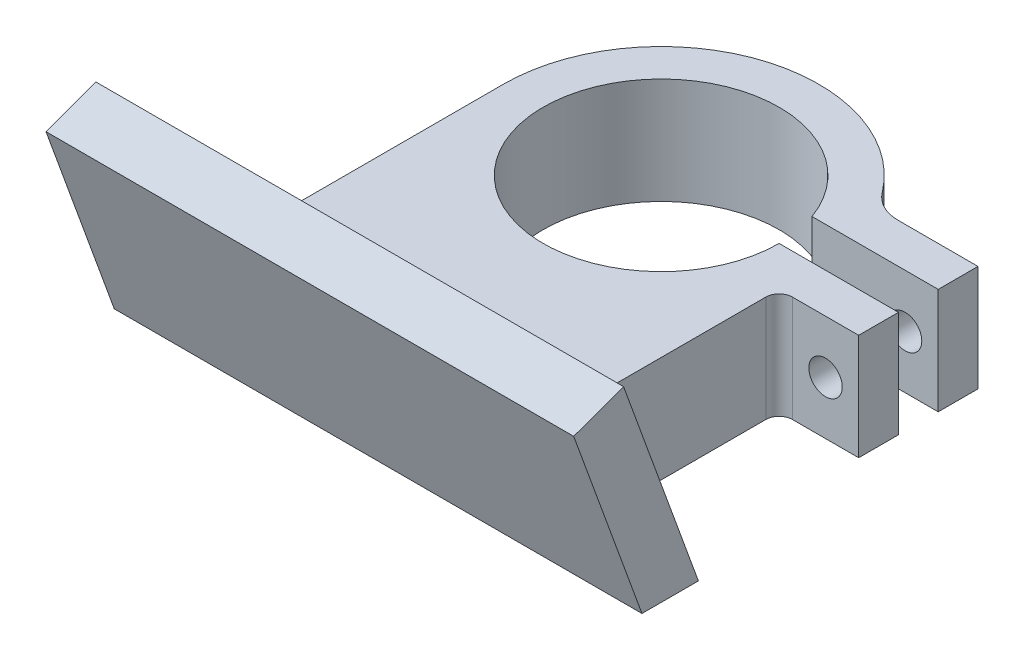
ISO-10303-21;
HEADER;
FILE_DESCRIPTION(('STEP AP214'),'2;1');
FILE_NAME('part.step','',(''),(''),'','','');
FILE_SCHEMA(('AUTOMOTIVE_DESIGN { 1 0 10303 214 1 1 1 1 }'));
ENDSEC;
DATA;
#1=APPLICATION_CONTEXT('core data for automotive mechanical design processes');
#2=APPLICATION_PROTOCOL_DEFINITION('international standard','automotive_design',2000,#1);
#3=PRODUCT_CONTEXT('',#1,'mechanical');
#4=PRODUCT('Part','Part','',(#3));
#5=PRODUCT_RELATED_PRODUCT_CATEGORY('part','',(#4));
#6=PRODUCT_DEFINITION_FORMATION('','',#4);
#7=PRODUCT_DEFINITION_CONTEXT('part definition',#1,'design');
#8=PRODUCT_DEFINITION('design','',#6,#7);
#9=PRODUCT_DEFINITION_SHAPE('','',#8);
#10=(LENGTH_UNIT() NAMED_UNIT(*) SI_UNIT(.MILLI.,.METRE.));
#11=(NAMED_UNIT(*) PLANE_ANGLE_UNIT() SI_UNIT($,.RADIAN.));
#12=(NAMED_UNIT(*) SI_UNIT($,.STERADIAN.) SOLID_ANGLE_UNIT());
#13=UNCERTAINTY_MEASURE_WITH_UNIT(LENGTH_MEASURE(1.E-05),#10,'distance_accuracy_value','');
#14=(GEOMETRIC_REPRESENTATION_CONTEXT(3) GLOBAL_UNCERTAINTY_ASSIGNED_CONTEXT((#13)) GLOBAL_UNIT_ASSIGNED_CONTEXT((#10,
#11,#12)) REPRESENTATION_CONTEXT('',''));
#15=CARTESIAN_POINT('',(0.,0.,0.));
#16=DIRECTION('',(0.,0.,1.));
#17=DIRECTION('',(1.,0.,0.));
#18=AXIS2_PLACEMENT_3D('',#15,#16,#17);
#19=CARTESIAN_POINT('',(22.733,10.16,3.81));
#20=DIRECTION('',(0.,0.,-1.));
#21=DIRECTION('',(-1.,0.,0.));
#22=AXIS2_PLACEMENT_3D('',#19,#20,#21);
#23=PLANE('',#22);
#24=CARTESIAN_POINT('',(19.558,5.08,3.81));
#25=DIRECTION('',(0.,0.,1.));
#26=DIRECTION('',(1.,0.,0.));
#27=AXIS2_PLACEMENT_3D('',#24,#25,#26);
#28=CIRCLE('',#27,1.5999968);
#29=CARTESIAN_POINT('',(21.1579968,5.08,3.81));
#30=VERTEX_POINT('',#29);
#31=EDGE_CURVE('E453',#30,#30,#28,.T.);
#32=ORIENTED_EDGE('',*,*,#31,.F.);
#33=EDGE_LOOP('',(#32));
#34=FACE_BOUND('',#33,.T.);
#35=DIRECTION('',(1.,0.,0.));
#36=VECTOR('',#35,1.);
#37=CARTESIAN_POINT('',(22.733,10.16,3.81));
#38=LINE('',#37,#36);
#39=CARTESIAN_POINT('',(16.383,10.16,3.81));
#40=VERTEX_POINT('',#39);
#41=CARTESIAN_POINT('',(22.733,10.16,3.81));
#42=VERTEX_POINT('',#41);
#43=EDGE_CURVE('E214',#40,#42,#38,.T.);
#44=ORIENTED_EDGE('',*,*,#43,.F.);
#45=DIRECTION('',(0.,-1.,0.));
#46=VECTOR('',#45,1.);
#47=CARTESIAN_POINT('',(16.383,0.,3.81));
#48=LINE('',#47,#46);
#49=CARTESIAN_POINT('',(16.383,0.,3.81));
#50=VERTEX_POINT('',#49);
#51=EDGE_CURVE('E313',#40,#50,#48,.T.);
#52=ORIENTED_EDGE('',*,*,#51,.T.);
#53=DIRECTION('',(1.,0.,0.));
#54=VECTOR('',#53,1.);
#55=CARTESIAN_POINT('',(22.733,0.,3.81));
#56=LINE('',#55,#54);
#57=CARTESIAN_POINT('',(22.733,0.,3.81));
#58=VERTEX_POINT('',#57);
#59=EDGE_CURVE('E213',#50,#58,#56,.T.);
#60=ORIENTED_EDGE('',*,*,#59,.T.);
#61=DIRECTION('',(0.,-1.,0.));
#62=VECTOR('',#61,1.);
#63=CARTESIAN_POINT('',(22.733,10.16,3.81));
#64=LINE('',#63,#62);
#65=EDGE_CURVE('E276',#42,#58,#64,.T.);
#66=ORIENTED_EDGE('',*,*,#65,.F.);
#67=EDGE_LOOP('',(#44,#52,#60,#66));
#68=FACE_BOUND('',#67,.T.);
#69=ADVANCED_FACE('F37',(#34,#68),#23,.F.);
#70=CARTESIAN_POINT('',(22.733,10.16,0.));
#71=DIRECTION('',(-1.,0.,0.));
#72=DIRECTION('',(0.,0.,1.));
#73=AXIS2_PLACEMENT_3D('',#70,#71,#72);
#74=PLANE('',#73);
#75=DIRECTION('',(0.,0.,-1.));
#76=VECTOR('',#75,1.);
#77=CARTESIAN_POINT('',(22.733,0.,0.));
#78=LINE('',#77,#76);
#79=CARTESIAN_POINT('',(22.733,0.,0.));
#80=VERTEX_POINT('',#79);
#81=EDGE_CURVE('E239',#58,#80,#78,.T.);
#82=ORIENTED_EDGE('',*,*,#81,.T.);
#83=DIRECTION('',(0.,-1.,0.));
#84=VECTOR('',#83,1.);
#85=CARTESIAN_POINT('',(22.733,10.16,0.));
#86=LINE('',#85,#84);
#87=CARTESIAN_POINT('',(22.733,10.16,0.));
#88=VERTEX_POINT('',#87);
#89=EDGE_CURVE('E273',#88,#80,#86,.T.);
#90=ORIENTED_EDGE('',*,*,#89,.F.);
#91=DIRECTION('',(0.,0.,-1.));
#92=VECTOR('',#91,1.);
#93=CARTESIAN_POINT('',(22.733,10.16,0.));
#94=LINE('',#93,#92);
#95=EDGE_CURVE('E216',#42,#88,#94,.T.);
#96=ORIENTED_EDGE('',*,*,#95,.F.);
#97=ORIENTED_EDGE('',*,*,#65,.T.);
#98=EDGE_LOOP('',(#82,#90,#96,#97));
#99=FACE_BOUND('',#98,.T.);
#100=ADVANCED_FACE('F328',(#99),#74,.F.);
#101=CARTESIAN_POINT('',(15.113,10.16,0.));
#102=DIRECTION('',(0.,0.,1.));
#103=DIRECTION('',(1.,0.,0.));
#104=AXIS2_PLACEMENT_3D('',#101,#102,#103);
#105=PLANE('',#104);
#106=CARTESIAN_POINT('',(19.558,5.08,0.));
#107=DIRECTION('',(0.,0.,1.));
#108=DIRECTION('',(1.,0.,0.));
#109=AXIS2_PLACEMENT_3D('',#106,#107,#108);
#110=CIRCLE('',#109,1.5999968);
#111=CARTESIAN_POINT('',(21.1579968,5.08,0.));
#112=VERTEX_POINT('',#111);
#113=EDGE_CURVE('E302',#112,#112,#110,.T.);
#114=ORIENTED_EDGE('',*,*,#113,.T.);
#115=EDGE_LOOP('',(#114));
#116=FACE_BOUND('',#115,.T.);
#117=DIRECTION('',(-1.,0.,0.));
#118=VECTOR('',#117,1.);
#119=CARTESIAN_POINT('',(15.113,0.,0.));
#120=LINE('',#119,#118);
#121=CARTESIAN_POINT('',(11.303,0.,0.));
#122=VERTEX_POINT('',#121);
#123=EDGE_CURVE('E242',#80,#122,#120,.T.);
#124=ORIENTED_EDGE('',*,*,#123,.T.);
#125=DIRECTION('',(0.,-1.,0.));
#126=VECTOR('',#125,1.);
#127=CARTESIAN_POINT('',(11.303,10.16,0.));
#128=LINE('',#127,#126);
#129=CARTESIAN_POINT('',(11.303,10.16,0.));
#130=VERTEX_POINT('',#129);
#131=EDGE_CURVE('E270',#130,#122,#128,.T.);
#132=ORIENTED_EDGE('',*,*,#131,.F.);
#133=DIRECTION('',(-1.,0.,0.));
#134=VECTOR('',#133,1.);
#135=CARTESIAN_POINT('',(15.113,10.16,0.));
#136=LINE('',#135,#134);
#137=EDGE_CURVE('E219',#88,#130,#136,.T.);
#138=ORIENTED_EDGE('',*,*,#137,.F.);
#139=ORIENTED_EDGE('',*,*,#89,.T.);
#140=EDGE_LOOP('',(#124,#132,#138,#139));
#141=FACE_BOUND('',#140,.T.);
#142=ADVANCED_FACE('F351',(#116,#141),#105,.F.);
#143=CARTESIAN_POINT('',(0.,10.16,0.));
#144=DIRECTION('',(0.,-1.,0.));
#145=DIRECTION('',(0.,0.,-1.));
#146=AXIS2_PLACEMENT_3D('',#143,#144,#145);
#147=CYLINDRICAL_SURFACE('',#146,11.303);
#148=CARTESIAN_POINT('',(0.,0.,0.));
#149=DIRECTION('',(0.,-1.,0.));
#150=DIRECTION('',(0.,0.,1.));
#151=AXIS2_PLACEMENT_3D('',#148,#149,#150);
#152=CIRCLE('',#151,11.303);
#153=CARTESIAN_POINT('',(10.6415087746052,0.,-3.81));
#154=VERTEX_POINT('',#153);
#155=EDGE_CURVE('E244',#122,#154,#152,.T.);
#156=ORIENTED_EDGE('',*,*,#155,.T.);
#157=DIRECTION('',(0.,-1.,0.));
#158=VECTOR('',#157,1.);
#159=CARTESIAN_POINT('',(10.6415087746052,10.16,-3.81));
#160=LINE('',#159,#158);
#161=CARTESIAN_POINT('',(10.6415087746052,10.16,-3.81));
#162=VERTEX_POINT('',#161);
#163=EDGE_CURVE('E267',#162,#154,#160,.T.);
#164=ORIENTED_EDGE('',*,*,#163,.F.);
#165=CARTESIAN_POINT('',(0.,10.16,0.));
#166=DIRECTION('',(0.,-1.,0.));
#167=DIRECTION('',(0.,0.,1.));
#168=AXIS2_PLACEMENT_3D('',#165,#166,#167);
#169=CIRCLE('',#168,11.303);
#170=EDGE_CURVE('E221',#130,#162,#169,.T.);
#171=ORIENTED_EDGE('',*,*,#170,.F.);
#172=ORIENTED_EDGE('',*,*,#131,.T.);
#173=EDGE_LOOP('',(#156,#164,#171,#172));
#174=FACE_BOUND('',#173,.T.);
#175=ADVANCED_FACE('F408',(#174),#147,.F.);
#176=CARTESIAN_POINT('',(10.6415087746052,10.16,-3.81));
#177=DIRECTION('',(0.,0.,-1.));
#178=DIRECTION('',(-1.,0.,0.));
#179=AXIS2_PLACEMENT_3D('',#176,#177,#178);
#180=PLANE('',#179);
#181=CARTESIAN_POINT('',(19.558,5.08,-3.81));
#182=DIRECTION('',(0.,0.,-1.));
#183=DIRECTION('',(-1.,0.,0.));
#184=AXIS2_PLACEMENT_3D('',#181,#182,#183);
#185=CIRCLE('',#184,1.5999968);
#186=CARTESIAN_POINT('',(17.9580032,5.08,-3.81));
#187=VERTEX_POINT('',#186);
#188=EDGE_CURVE('E455',#187,#187,#185,.T.);
#189=ORIENTED_EDGE('',*,*,#188,.T.);
#190=EDGE_LOOP('',(#189));
#191=FACE_BOUND('',#190,.T.);
#192=DIRECTION('',(1.,0.,0.));
#193=VECTOR('',#192,1.);
#194=CARTESIAN_POINT('',(10.6415087746052,0.,-3.81));
#195=LINE('',#194,#193);
#196=CARTESIAN_POINT('',(22.733,0.,-3.81));
#197=VERTEX_POINT('',#196);
#198=EDGE_CURVE('E246',#154,#197,#195,.T.);
#199=ORIENTED_EDGE('',*,*,#198,.T.);
#200=DIRECTION('',(0.,-1.,0.));
#201=VECTOR('',#200,1.);
#202=CARTESIAN_POINT('',(22.733,10.16,-3.81));
#203=LINE('',#202,#201);
#204=CARTESIAN_POINT('',(22.733,10.16,-3.81));
#205=VERTEX_POINT('',#204);
#206=EDGE_CURVE('E264',#205,#197,#203,.T.);
#207=ORIENTED_EDGE('',*,*,#206,.F.);
#208=DIRECTION('',(1.,0.,0.));
#209=VECTOR('',#208,1.);
#210=CARTESIAN_POINT('',(10.6415087746052,10.16,-3.81));
#211=LINE('',#210,#209);
#212=EDGE_CURVE('E223',#162,#205,#211,.T.);
#213=ORIENTED_EDGE('',*,*,#212,.F.);
#214=ORIENTED_EDGE('',*,*,#163,.T.);
#215=EDGE_LOOP('',(#199,#207,#213,#214));
#216=FACE_BOUND('',#215,.T.);
#217=ADVANCED_FACE('F404',(#191,#216),#180,.F.);
#218=CARTESIAN_POINT('',(22.733,10.16,-3.81));
#219=DIRECTION('',(-1.,0.,0.));
#220=DIRECTION('',(0.,0.,1.));
#221=AXIS2_PLACEMENT_3D('',#218,#219,#220);
#222=PLANE('',#221);
#223=DIRECTION('',(0.,0.,-1.));
#224=VECTOR('',#223,1.);
#225=CARTESIAN_POINT('',(22.733,0.,-3.81));
#226=LINE('',#225,#224);
#227=CARTESIAN_POINT('',(22.733,0.,-7.62));
#228=VERTEX_POINT('',#227);
#229=EDGE_CURVE('E248',#197,#228,#226,.T.);
#230=ORIENTED_EDGE('',*,*,#229,.T.);
#231=DIRECTION('',(0.,-1.,0.));
#232=VECTOR('',#231,1.);
#233=CARTESIAN_POINT('',(22.733,10.16,-7.62));
#234=LINE('',#233,#232);
#235=CARTESIAN_POINT('',(22.733,10.16,-7.62));
#236=VERTEX_POINT('',#235);
#237=EDGE_CURVE('E261',#236,#228,#234,.T.);
#238=ORIENTED_EDGE('',*,*,#237,.F.);
#239=DIRECTION('',(0.,0.,-1.));
#240=VECTOR('',#239,1.);
#241=CARTESIAN_POINT('',(22.733,10.16,-3.81));
#242=LINE('',#241,#240);
#243=EDGE_CURVE('E225',#205,#236,#242,.T.);
#244=ORIENTED_EDGE('',*,*,#243,.F.);
#245=ORIENTED_EDGE('',*,*,#206,.T.);
#246=EDGE_LOOP('',(#230,#238,#244,#245));
#247=FACE_BOUND('',#246,.T.);
#248=ADVANCED_FACE('F401',(#247),#222,.F.);
#249=CARTESIAN_POINT('',(22.733,10.16,-7.62));
#250=DIRECTION('',(0.,0.,1.));
#251=DIRECTION('',(1.,0.,0.));
#252=AXIS2_PLACEMENT_3D('',#249,#250,#251);
#253=PLANE('',#252);
#254=CARTESIAN_POINT('',(19.558,5.08,-7.62));
#255=DIRECTION('',(0.,0.,1.));
#256=DIRECTION('',(1.,0.,0.));
#257=AXIS2_PLACEMENT_3D('',#254,#255,#256);
#258=CIRCLE('',#257,1.5999968);
#259=CARTESIAN_POINT('',(21.1579968,5.08,-7.62));
#260=VERTEX_POINT('',#259);
#261=EDGE_CURVE('E41',#260,#260,#258,.T.);
#262=ORIENTED_EDGE('',*,*,#261,.T.);
#263=EDGE_LOOP('',(#262));
#264=FACE_BOUND('',#263,.T.);
#265=DIRECTION('',(-1.,0.,0.));
#266=VECTOR('',#265,1.);
#267=CARTESIAN_POINT('',(22.733,0.,-7.62));
#268=LINE('',#267,#266);
#269=CARTESIAN_POINT('',(15.0809492075267,0.,-7.62));
#270=VERTEX_POINT('',#269);
#271=EDGE_CURVE('E250',#228,#270,#268,.T.);
#272=ORIENTED_EDGE('',*,*,#271,.T.);
#273=DIRECTION('',(0.,1.,0.));
#274=VECTOR('',#273,1.);
#275=CARTESIAN_POINT('',(15.0809492075267,10.16,-7.62));
#276=LINE('',#275,#274);
#277=CARTESIAN_POINT('',(15.0809492075267,10.16,-7.62));
#278=VERTEX_POINT('',#277);
#279=EDGE_CURVE('E307',#270,#278,#276,.T.);
#280=ORIENTED_EDGE('',*,*,#279,.T.);
#281=DIRECTION('',(-1.,0.,0.));
#282=VECTOR('',#281,1.);
#283=CARTESIAN_POINT('',(22.733,10.16,-7.62));
#284=LINE('',#283,#282);
#285=EDGE_CURVE('E227',#236,#278,#284,.T.);
#286=ORIENTED_EDGE('',*,*,#285,.F.);
#287=ORIENTED_EDGE('',*,*,#237,.T.);
#288=EDGE_LOOP('',(#272,#280,#286,#287));
#289=FACE_BOUND('',#288,.T.);
#290=ADVANCED_FACE('F393',(#264,#289),#253,.F.);
#291=CARTESIAN_POINT('',(0.,10.16,0.));
#292=DIRECTION('',(0.,-1.,0.));
#293=DIRECTION('',(0.,0.,-1.));
#294=AXIS2_PLACEMENT_3D('',#291,#292,#293);
#295=CYLINDRICAL_SURFACE('',#294,15.113);
#296=CARTESIAN_POINT('',(0.,10.16,0.));
#297=DIRECTION('',(0.,1.,0.));
#298=DIRECTION('',(0.,0.,1.));
#299=AXIS2_PLACEMENT_3D('',#296,#297,#298);
#300=CIRCLE('',#299,15.113);
#301=CARTESIAN_POINT('',(12.044516481179,10.16,-9.1286577181208));
#302=VERTEX_POINT('',#301);
#303=CARTESIAN_POINT('',(-15.113,10.16,0.));
#304=VERTEX_POINT('',#303);
#305=EDGE_CURVE('E230',#302,#304,#300,.T.);
#306=ORIENTED_EDGE('',*,*,#305,.F.);
#307=DIRECTION('',(0.,-1.,0.));
#308=VECTOR('',#307,1.);
#309=CARTESIAN_POINT('',(12.044516481179,10.16,-9.1286577181208));
#310=LINE('',#309,#308);
#311=CARTESIAN_POINT('',(12.044516481179,0.,-9.1286577181208));
#312=VERTEX_POINT('',#311);
#313=EDGE_CURVE('E299',#302,#312,#310,.T.);
#314=ORIENTED_EDGE('',*,*,#313,.T.);
#315=CARTESIAN_POINT('',(0.,0.,0.));
#316=DIRECTION('',(0.,1.,0.));
#317=DIRECTION('',(0.,0.,1.));
#318=AXIS2_PLACEMENT_3D('',#315,#316,#317);
#319=CIRCLE('',#318,15.113);
#320=CARTESIAN_POINT('',(-15.113,0.,0.));
#321=VERTEX_POINT('',#320);
#322=EDGE_CURVE('E253',#312,#321,#319,.T.);
#323=ORIENTED_EDGE('',*,*,#322,.T.);
#324=DIRECTION('',(0.,-1.,0.));
#325=VECTOR('',#324,1.);
#326=CARTESIAN_POINT('',(-15.113,10.16,0.));
#327=LINE('',#326,#325);
#328=EDGE_CURVE('E237',#304,#321,#327,.T.);
#329=ORIENTED_EDGE('',*,*,#328,.F.);
#330=EDGE_LOOP('',(#306,#314,#323,#329));
#331=FACE_BOUND('',#330,.T.);
#332=ADVANCED_FACE('F387',(#331),#295,.T.);
#333=CARTESIAN_POINT('',(-15.113,10.16,0.));
#334=DIRECTION('',(1.,0.,0.));
#335=DIRECTION('',(0.,0.,-1.));
#336=AXIS2_PLACEMENT_3D('',#333,#334,#335);
#337=PLANE('',#336);
#338=DIRECTION('',(0.,0.,1.));
#339=VECTOR('',#338,1.);
#340=CARTESIAN_POINT('',(-15.113,0.,0.));
#341=LINE('',#340,#339);
#342=CARTESIAN_POINT('',(-15.113,0.,16.2960393356777));
#343=VERTEX_POINT('',#342);
#344=EDGE_CURVE('E255',#321,#343,#341,.T.);
#345=ORIENTED_EDGE('',*,*,#344,.T.);
#346=DIRECTION('',(0.,-0.939692620785908,-0.342020143325669));
#347=VECTOR('',#346,1.);
#348=CARTESIAN_POINT('',(-15.113,11.8974623280944,20.6263614864076));
#349=LINE('',#348,#347);
#350=CARTESIAN_POINT('',(-15.113,10.16,19.9939769158224));
#351=VERTEX_POINT('',#350);
#352=EDGE_CURVE('E287',#343,#351,#349,.F.);
#353=ORIENTED_EDGE('',*,*,#352,.T.);
#354=DIRECTION('',(0.,0.,1.));
#355=VECTOR('',#354,1.);
#356=CARTESIAN_POINT('',(-15.113,10.16,0.));
#357=LINE('',#356,#355);
#358=EDGE_CURVE('E232',#304,#351,#357,.T.);
#359=ORIENTED_EDGE('',*,*,#358,.F.);
#360=ORIENTED_EDGE('',*,*,#328,.T.);
#361=EDGE_LOOP('',(#345,#353,#359,#360));
#362=FACE_BOUND('',#361,.T.);
#363=ADVANCED_FACE('F382',(#362),#337,.F.);
#364=CARTESIAN_POINT('',(15.113,10.16,25.4));
#365=DIRECTION('',(-1.,0.,0.));
#366=DIRECTION('',(0.,0.,1.));
#367=AXIS2_PLACEMENT_3D('',#364,#365,#366);
#368=PLANE('',#367);
#369=DIRECTION('',(0.,0.,-1.));
#370=VECTOR('',#369,1.);
#371=CARTESIAN_POINT('',(15.113,0.,25.4));
#372=LINE('',#371,#370);
#373=CARTESIAN_POINT('',(15.113,0.,16.2960393356777));
#374=VERTEX_POINT('',#373);
#375=CARTESIAN_POINT('',(15.113,0.,5.08));
#376=VERTEX_POINT('',#375);
#377=EDGE_CURVE('E217',#374,#376,#372,.T.);
#378=ORIENTED_EDGE('',*,*,#377,.T.);
#379=DIRECTION('',(0.,-1.,0.));
#380=VECTOR('',#379,1.);
#381=CARTESIAN_POINT('',(15.113,10.16,5.08));
#382=LINE('',#381,#380);
#383=CARTESIAN_POINT('',(15.113,10.16,5.08));
#384=VERTEX_POINT('',#383);
#385=EDGE_CURVE('E59',#376,#384,#382,.F.);
#386=ORIENTED_EDGE('',*,*,#385,.T.);
#387=DIRECTION('',(0.,0.,-1.));
#388=VECTOR('',#387,1.);
#389=CARTESIAN_POINT('',(15.113,10.16,25.4));
#390=LINE('',#389,#388);
#391=CARTESIAN_POINT('',(15.113,10.16,19.9939769158224));
#392=VERTEX_POINT('',#391);
#393=EDGE_CURVE('E235',#392,#384,#390,.T.);
#394=ORIENTED_EDGE('',*,*,#393,.F.);
#395=DIRECTION('',(0.,0.939692620785908,0.342020143325669));
#396=VECTOR('',#395,1.);
#397=CARTESIAN_POINT('',(15.113,1.7374623280944,16.928423906263));
#398=LINE('',#397,#396);
#399=EDGE_CURVE('E285',#392,#374,#398,.F.);
#400=ORIENTED_EDGE('',*,*,#399,.T.);
#401=EDGE_LOOP('',(#378,#386,#394,#400));
#402=FACE_BOUND('',#401,.T.);
#403=ADVANCED_FACE('F430',(#402),#368,.F.);
#404=CARTESIAN_POINT('',(0.,10.16,0.));
#405=DIRECTION('',(0.,1.,0.));
#406=DIRECTION('',(0.,0.,1.));
#407=AXIS2_PLACEMENT_3D('',#404,#405,#406);
#408=PLANE('',#407);
#409=CARTESIAN_POINT('',(-20.193,10.16,19.9939769158224));
#410=DIRECTION('',(0.,1.,0.));
#411=DIRECTION('',(0.,0.,1.));
#412=AXIS2_PLACEMENT_3D('',#409,#410,#411);
#413=ELLIPSE('',#412,5.40602308417763,5.08);
#414=CARTESIAN_POINT('',(-15.4193614864076,10.16,21.8429457058947));
#415=VERTEX_POINT('',#414);
#416=EDGE_CURVE('E296',#351,#415,#413,.F.);
#417=ORIENTED_EDGE('',*,*,#416,.T.);
#418=DIRECTION('',(1.,0.,0.));
#419=VECTOR('',#418,1.);
#420=CARTESIAN_POINT('',(0.,10.16,21.8429457058947));
#421=LINE('',#420,#419);
#422=CARTESIAN_POINT('',(15.4193614864076,10.16,21.8429457058947));
#423=VERTEX_POINT('',#422);
#424=EDGE_CURVE('E289',#415,#423,#421,.T.);
#425=ORIENTED_EDGE('',*,*,#424,.T.);
#426=CARTESIAN_POINT('',(20.193,10.16,19.9939769158224));
#427=DIRECTION('',(0.,1.,0.));
#428=DIRECTION('',(0.,0.,-1.));
#429=AXIS2_PLACEMENT_3D('',#426,#427,#428);
#430=ELLIPSE('',#429,5.40602308417763,5.08);
#431=EDGE_CURVE('E291',#423,#392,#430,.F.);
#432=ORIENTED_EDGE('',*,*,#431,.T.);
#433=ORIENTED_EDGE('',*,*,#393,.T.);
#434=CARTESIAN_POINT('',(16.383,10.16,5.08));
#435=DIRECTION('',(0.,1.,0.));
#436=DIRECTION('',(0.,0.,1.));
#437=AXIS2_PLACEMENT_3D('',#434,#435,#436);
#438=CIRCLE('',#437,1.27);
#439=EDGE_CURVE('E11',#384,#40,#438,.F.);
#440=ORIENTED_EDGE('',*,*,#439,.T.);
#441=ORIENTED_EDGE('',*,*,#43,.T.);
#442=ORIENTED_EDGE('',*,*,#95,.T.);
#443=ORIENTED_EDGE('',*,*,#137,.T.);
#444=ORIENTED_EDGE('',*,*,#170,.T.);
#445=ORIENTED_EDGE('',*,*,#212,.T.);
#446=ORIENTED_EDGE('',*,*,#243,.T.);
#447=ORIENTED_EDGE('',*,*,#285,.T.);
#448=CARTESIAN_POINT('',(15.0809492075267,10.16,-11.43));
#449=DIRECTION('',(0.,1.,0.));
#450=DIRECTION('',(0.,0.,1.));
#451=AXIS2_PLACEMENT_3D('',#448,#449,#450);
#452=CIRCLE('',#451,3.81);
#453=EDGE_CURVE('E311',#278,#302,#452,.F.);
#454=ORIENTED_EDGE('',*,*,#453,.T.);
#455=ORIENTED_EDGE('',*,*,#305,.T.);
#456=ORIENTED_EDGE('',*,*,#358,.T.);
#457=EDGE_LOOP('',(#417,#425,#432,#433,#440,#441,#442,#443,#444,#445,#446,#447,#454,#455,#456));
#458=FACE_BOUND('',#457,.T.);
#459=ADVANCED_FACE('F331',(#458),#408,.T.);
#460=CARTESIAN_POINT('',(0.,0.,0.));
#461=DIRECTION('',(0.,1.,0.));
#462=DIRECTION('',(0.,0.,1.));
#463=AXIS2_PLACEMENT_3D('',#460,#461,#462);
#464=PLANE('',#463);
#465=ORIENTED_EDGE('',*,*,#377,.F.);
#466=CARTESIAN_POINT('',(20.193,0.,16.2960393356777));
#467=DIRECTION('',(0.,1.,0.));
#468=DIRECTION('',(0.,0.,-1.));
#469=AXIS2_PLACEMENT_3D('',#466,#467,#468);
#470=ELLIPSE('',#469,5.40602308417763,5.08);
#471=CARTESIAN_POINT('',(20.193,0.,21.7020624198554));
#472=VERTEX_POINT('',#471);
#473=EDGE_CURVE('E179',#374,#472,#470,.T.);
#474=ORIENTED_EDGE('',*,*,#473,.T.);
#475=DIRECTION('',(1.,0.,0.));
#476=VECTOR('',#475,1.);
#477=CARTESIAN_POINT('',(-25.273,0.,21.7020624198554));
#478=LINE('',#477,#476);
#479=CARTESIAN_POINT('',(25.273,0.,21.7020624198554));
#480=VERTEX_POINT('',#479);
#481=EDGE_CURVE('E173',#472,#480,#478,.T.);
#482=ORIENTED_EDGE('',*,*,#481,.T.);
#483=DIRECTION('',(0.,0.,1.));
#484=VECTOR('',#483,1.);
#485=CARTESIAN_POINT('',(25.273,0.,21.7020624198554));
#486=LINE('',#485,#484);
#487=CARTESIAN_POINT('',(25.273,0.,27.108085504033));
#488=VERTEX_POINT('',#487);
#489=EDGE_CURVE('E176',#480,#488,#486,.T.);
#490=ORIENTED_EDGE('',*,*,#489,.T.);
#491=DIRECTION('',(-1.,0.,0.));
#492=VECTOR('',#491,1.);
#493=CARTESIAN_POINT('',(25.274,0.,27.108085504033));
#494=LINE('',#493,#492);
#495=CARTESIAN_POINT('',(-25.273,0.,27.108085504033));
#496=VERTEX_POINT('',#495);
#497=EDGE_CURVE('E462',#488,#496,#494,.T.);
#498=ORIENTED_EDGE('',*,*,#497,.T.);
#499=DIRECTION('',(0.,0.,-1.));
#500=VECTOR('',#499,1.);
#501=CARTESIAN_POINT('',(-25.273,0.,21.7020624198554));
#502=LINE('',#501,#500);
#503=CARTESIAN_POINT('',(-25.273,0.,21.7020624198554));
#504=VERTEX_POINT('',#503);
#505=EDGE_CURVE('E194',#496,#504,#502,.T.);
#506=ORIENTED_EDGE('',*,*,#505,.T.);
#507=CARTESIAN_POINT('',(-20.193,0.,21.7020624198554));
#508=VERTEX_POINT('',#507);
#509=EDGE_CURVE('E184',#504,#508,#478,.T.);
#510=ORIENTED_EDGE('',*,*,#509,.T.);
#511=CARTESIAN_POINT('',(-20.193,0.,16.2960393356777));
#512=DIRECTION('',(0.,1.,0.));
#513=DIRECTION('',(0.,0.,1.));
#514=AXIS2_PLACEMENT_3D('',#511,#512,#513);
#515=ELLIPSE('',#514,5.40602308417763,5.08);
#516=EDGE_CURVE('E294',#508,#343,#515,.T.);
#517=ORIENTED_EDGE('',*,*,#516,.T.);
#518=ORIENTED_EDGE('',*,*,#344,.F.);
#519=ORIENTED_EDGE('',*,*,#322,.F.);
#520=CARTESIAN_POINT('',(15.0809492075267,0.,-11.43));
#521=DIRECTION('',(0.,1.,0.));
#522=DIRECTION('',(0.,0.,1.));
#523=AXIS2_PLACEMENT_3D('',#520,#521,#522);
#524=CIRCLE('',#523,3.81);
#525=EDGE_CURVE('E309',#312,#270,#524,.T.);
#526=ORIENTED_EDGE('',*,*,#525,.T.);
#527=ORIENTED_EDGE('',*,*,#271,.F.);
#528=ORIENTED_EDGE('',*,*,#229,.F.);
#529=ORIENTED_EDGE('',*,*,#198,.F.);
#530=ORIENTED_EDGE('',*,*,#155,.F.);
#531=ORIENTED_EDGE('',*,*,#123,.F.);
#532=ORIENTED_EDGE('',*,*,#81,.F.);
#533=ORIENTED_EDGE('',*,*,#59,.F.);
#534=CARTESIAN_POINT('',(16.383,0.,5.08));
#535=DIRECTION('',(0.,1.,0.));
#536=DIRECTION('',(0.,0.,1.));
#537=AXIS2_PLACEMENT_3D('',#534,#535,#536);
#538=CIRCLE('',#537,1.27);
#539=EDGE_CURVE('E46',#50,#376,#538,.T.);
#540=ORIENTED_EDGE('',*,*,#539,.T.);
#541=EDGE_LOOP('',(#465,#474,#482,#490,#498,#506,#510,#517,#518,#519,#526,#527,#528,#529,#530,
#531,#532,#533,#540));
#542=FACE_BOUND('',#541,.T.);
#543=ADVANCED_FACE('F175',(#542),#464,.F.);
#544=CARTESIAN_POINT('',(0.,-6.97490841406346,19.1634033704034));
#545=DIRECTION('',(0.,-0.342020143325669,0.939692620785908));
#546=DIRECTION('',(0.,-0.939692620785908,-0.342020143325669));
#547=AXIS2_PLACEMENT_3D('',#544,#545,#546);
#548=PLANE('',#547);
#549=ORIENTED_EDGE('',*,*,#481,.F.);
#550=DIRECTION('',(0.,0.939692620785908,0.342020143325669));
#551=VECTOR('',#550,1.);
#552=CARTESIAN_POINT('',(20.193,10.16,25.4));
#553=LINE('',#552,#551);
#554=CARTESIAN_POINT('',(20.193,13.5025376719056,26.6165842194871));
#555=VERTEX_POINT('',#554);
#556=EDGE_CURVE('E283',#472,#555,#553,.T.);
#557=ORIENTED_EDGE('',*,*,#556,.T.);
#558=DIRECTION('',(1.,0.,0.));
#559=VECTOR('',#558,1.);
#560=CARTESIAN_POINT('',(0.,13.5025376719056,26.6165842194871));
#561=LINE('',#560,#559);
#562=CARTESIAN_POINT('',(-20.193,13.5025376719056,26.6165842194871));
#563=VERTEX_POINT('',#562);
#564=EDGE_CURVE('E279',#555,#563,#561,.F.);
#565=ORIENTED_EDGE('',*,*,#564,.T.);
#566=DIRECTION('',(0.,-0.939692620785908,-0.342020143325669));
#567=VECTOR('',#566,1.);
#568=CARTESIAN_POINT('',(-20.193,0.,21.7020624198554));
#569=LINE('',#568,#567);
#570=EDGE_CURVE('E281',#563,#508,#569,.T.);
#571=ORIENTED_EDGE('',*,*,#570,.T.);
#572=ORIENTED_EDGE('',*,*,#509,.F.);
#573=DIRECTION('',(0.,-0.939692620785908,-0.342020143325669));
#574=VECTOR('',#573,1.);
#575=CARTESIAN_POINT('',(-25.273,19.7072770271848,28.8749246561888));
#576=LINE('',#575,#574);
#577=CARTESIAN_POINT('',(-25.273,19.7072770271848,28.8749246561888));
#578=VERTEX_POINT('',#577);
#579=EDGE_CURVE('E185',#578,#504,#576,.T.);
#580=ORIENTED_EDGE('',*,*,#579,.F.);
#581=DIRECTION('',(-1.,0.,0.));
#582=VECTOR('',#581,1.);
#583=CARTESIAN_POINT('',(25.273,19.7072770271848,28.8749246561888));
#584=LINE('',#583,#582);
#585=CARTESIAN_POINT('',(25.273,19.7072770271848,28.8749246561888));
#586=VERTEX_POINT('',#585);
#587=EDGE_CURVE('E200',#586,#578,#584,.T.);
#588=ORIENTED_EDGE('',*,*,#587,.F.);
#589=DIRECTION('',(0.,0.939692620785908,0.342020143325669));
#590=VECTOR('',#589,1.);
#591=CARTESIAN_POINT('',(25.273,0.,21.7020624198554));
#592=LINE('',#591,#590);
#593=EDGE_CURVE('E191',#480,#586,#592,.T.);
#594=ORIENTED_EDGE('',*,*,#593,.F.);
#595=EDGE_LOOP('',(#549,#557,#565,#571,#572,#580,#588,#594));
#596=FACE_BOUND('',#595,.T.);
#597=ADVANCED_FACE('F198',(#596),#548,.F.);
#598=CARTESIAN_POINT('',(-25.273,17.9698146990904,33.6485631697812));
#599=DIRECTION('',(1.,0.,0.));
#600=DIRECTION('',(0.,0.,-1.));
#601=AXIS2_PLACEMENT_3D('',#598,#599,#600);
#602=PLANE('',#601);
#603=ORIENTED_EDGE('',*,*,#579,.T.);
#604=ORIENTED_EDGE('',*,*,#505,.F.);
#605=DIRECTION('',(0.,-0.939692620785908,-0.342020143325669));
#606=VECTOR('',#605,1.);
#607=CARTESIAN_POINT('',(-25.273,17.9698146990904,33.6485631697812));
#608=LINE('',#607,#606);
#609=CARTESIAN_POINT('',(-25.273,17.9698146990904,33.6485631697812));
#610=VERTEX_POINT('',#609);
#611=EDGE_CURVE('E202',#610,#496,#608,.T.);
#612=ORIENTED_EDGE('',*,*,#611,.F.);
#613=DIRECTION('',(0.,0.342020143325669,-0.939692620785908));
#614=VECTOR('',#613,1.);
#615=CARTESIAN_POINT('',(-25.273,17.9698146990904,33.6485631697812));
#616=LINE('',#615,#614);
#617=EDGE_CURVE('E207',#610,#578,#616,.T.);
#618=ORIENTED_EDGE('',*,*,#617,.T.);
#619=EDGE_LOOP('',(#603,#604,#612,#618));
#620=FACE_BOUND('',#619,.T.);
#621=ADVANCED_FACE('F437',(#620),#602,.F.);
#622=CARTESIAN_POINT('',(25.273,-1.7374623280944,26.4757009334478));
#623=DIRECTION('',(-1.,0.,0.));
#624=DIRECTION('',(0.,-1.,0.));
#625=AXIS2_PLACEMENT_3D('',#622,#623,#624);
#626=PLANE('',#625);
#627=DIRECTION('',(0.,0.939692620785908,0.342020143325669));
#628=VECTOR('',#627,1.);
#629=CARTESIAN_POINT('',(25.273,-1.7374623280944,26.4757009334478));
#630=LINE('',#629,#628);
#631=CARTESIAN_POINT('',(25.273,17.9698146990904,33.6485631697812));
#632=VERTEX_POINT('',#631);
#633=EDGE_CURVE('E193',#488,#632,#630,.T.);
#634=ORIENTED_EDGE('',*,*,#633,.F.);
#635=ORIENTED_EDGE('',*,*,#489,.F.);
#636=ORIENTED_EDGE('',*,*,#593,.T.);
#637=DIRECTION('',(0.,0.342020143325669,-0.939692620785908));
#638=VECTOR('',#637,1.);
#639=CARTESIAN_POINT('',(25.273,17.9698146990904,33.6485631697812));
#640=LINE('',#639,#638);
#641=EDGE_CURVE('E210',#632,#586,#640,.T.);
#642=ORIENTED_EDGE('',*,*,#641,.F.);
#643=EDGE_LOOP('',(#634,#635,#636,#642));
#644=FACE_BOUND('',#643,.T.);
#645=ADVANCED_FACE('F189',(#644),#626,.F.);
#646=CARTESIAN_POINT('',(25.273,17.9698146990904,33.6485631697812));
#647=DIRECTION('',(0.,-0.939692620785908,-0.342020143325669));
#648=DIRECTION('',(0.,0.342020143325669,-0.939692620785908));
#649=AXIS2_PLACEMENT_3D('',#646,#647,#648);
#650=PLANE('',#649);
#651=ORIENTED_EDGE('',*,*,#587,.T.);
#652=ORIENTED_EDGE('',*,*,#617,.F.);
#653=DIRECTION('',(-1.,0.,0.));
#654=VECTOR('',#653,1.);
#655=CARTESIAN_POINT('',(25.273,17.9698146990904,33.6485631697812));
#656=LINE('',#655,#654);
#657=EDGE_CURVE('E211',#632,#610,#656,.T.);
#658=ORIENTED_EDGE('',*,*,#657,.F.);
#659=ORIENTED_EDGE('',*,*,#641,.T.);
#660=EDGE_LOOP('',(#651,#652,#658,#659));
#661=FACE_BOUND('',#660,.T.);
#662=ADVANCED_FACE('F370',(#661),#650,.F.);
#663=CARTESIAN_POINT('',(0.,-8.71237074215786,23.9370418839958));
#664=DIRECTION('',(0.,-0.342020143325669,0.939692620785908));
#665=DIRECTION('',(0.,-0.939692620785908,-0.342020143325669));
#666=AXIS2_PLACEMENT_3D('',#663,#664,#665);
#667=PLANE('',#666);
#668=ORIENTED_EDGE('',*,*,#497,.F.);
#669=ORIENTED_EDGE('',*,*,#633,.T.);
#670=ORIENTED_EDGE('',*,*,#657,.T.);
#671=ORIENTED_EDGE('',*,*,#611,.T.);
#672=EDGE_LOOP('',(#668,#669,#670,#671));
#673=FACE_BOUND('',#672,.T.);
#674=ADVANCED_FACE('F365',(#673),#667,.T.);
#675=CARTESIAN_POINT('',(-20.193,-5.23744608596906,14.389764856811));
#676=DIRECTION('',(0.,0.939692620785908,0.342020143325669));
#677=DIRECTION('',(0.,-0.342020143325669,0.939692620785908));
#678=AXIS2_PLACEMENT_3D('',#675,#676,#677);
#679=CYLINDRICAL_SURFACE('',#678,5.08);
#680=ORIENTED_EDGE('',*,*,#516,.F.);
#681=ORIENTED_EDGE('',*,*,#570,.F.);
#682=CARTESIAN_POINT('',(-20.193,15.24,21.8429457058947));
#683=DIRECTION('',(0.707106781186547,0.664463024388675,0.241844762647975));
#684=DIRECTION('',(0.707106781186547,-0.664463024388675,-0.241844762647976));
#685=AXIS2_PLACEMENT_3D('',#682,#683,#684);
#686=ELLIPSE('',#685,7.18420489685532,5.08);
#687=EDGE_CURVE('E195',#415,#563,#686,.F.);
#688=ORIENTED_EDGE('',*,*,#687,.F.);
#689=ORIENTED_EDGE('',*,*,#416,.F.);
#690=ORIENTED_EDGE('',*,*,#352,.F.);
#691=EDGE_LOOP('',(#680,#681,#688,#689,#690));
#692=FACE_BOUND('',#691,.T.);
#693=ADVANCED_FACE('F362',(#692),#679,.F.);
#694=CARTESIAN_POINT('',(0.,15.24,21.8429457058947));
#695=DIRECTION('',(1.,0.,0.));
#696=DIRECTION('',(0.,0.,-1.));
#697=AXIS2_PLACEMENT_3D('',#694,#695,#696);
#698=CYLINDRICAL_SURFACE('',#697,5.08);
#699=ORIENTED_EDGE('',*,*,#687,.T.);
#700=ORIENTED_EDGE('',*,*,#564,.F.);
#701=CARTESIAN_POINT('',(20.193,15.24,21.8429457058947));
#702=DIRECTION('',(0.707106781186547,-0.664463024388675,-0.241844762647976));
#703=DIRECTION('',(0.707106781186547,0.664463024388675,0.241844762647975));
#704=AXIS2_PLACEMENT_3D('',#701,#702,#703);
#705=ELLIPSE('',#704,7.18420489685532,5.08);
#706=EDGE_CURVE('E300',#423,#555,#705,.F.);
#707=ORIENTED_EDGE('',*,*,#706,.F.);
#708=ORIENTED_EDGE('',*,*,#424,.F.);
#709=EDGE_LOOP('',(#699,#700,#707,#708));
#710=FACE_BOUND('',#709,.T.);
#711=ADVANCED_FACE('F358',(#710),#698,.F.);
#712=CARTESIAN_POINT('',(20.193,-5.23744608596906,14.389764856811));
#713=DIRECTION('',(0.,-0.939692620785908,-0.342020143325669));
#714=DIRECTION('',(0.,0.342020143325669,-0.939692620785908));
#715=AXIS2_PLACEMENT_3D('',#712,#713,#714);
#716=CYLINDRICAL_SURFACE('',#715,5.08);
#717=ORIENTED_EDGE('',*,*,#473,.F.);
#718=ORIENTED_EDGE('',*,*,#399,.F.);
#719=ORIENTED_EDGE('',*,*,#431,.F.);
#720=ORIENTED_EDGE('',*,*,#706,.T.);
#721=ORIENTED_EDGE('',*,*,#556,.F.);
#722=EDGE_LOOP('',(#717,#718,#719,#720,#721));
#723=FACE_BOUND('',#722,.T.);
#724=ADVANCED_FACE('F343',(#723),#716,.F.);
#725=CARTESIAN_POINT('',(15.0809492075267,10.16,-11.43));
#726=DIRECTION('',(0.,-1.,0.));
#727=DIRECTION('',(0.,0.,-1.));
#728=AXIS2_PLACEMENT_3D('',#725,#726,#727);
#729=CYLINDRICAL_SURFACE('',#728,3.81);
#730=ORIENTED_EDGE('',*,*,#453,.F.);
#731=ORIENTED_EDGE('',*,*,#279,.F.);
#732=ORIENTED_EDGE('',*,*,#525,.F.);
#733=ORIENTED_EDGE('',*,*,#313,.F.);
#734=EDGE_LOOP('',(#730,#731,#732,#733));
#735=FACE_BOUND('',#734,.T.);
#736=ADVANCED_FACE('F335',(#735),#729,.F.);
#737=CARTESIAN_POINT('',(16.383,10.16,5.08));
#738=DIRECTION('',(0.,1.,0.));
#739=DIRECTION('',(0.,0.,1.));
#740=AXIS2_PLACEMENT_3D('',#737,#738,#739);
#741=CYLINDRICAL_SURFACE('',#740,1.27);
#742=ORIENTED_EDGE('',*,*,#439,.F.);
#743=ORIENTED_EDGE('',*,*,#385,.F.);
#744=ORIENTED_EDGE('',*,*,#539,.F.);
#745=ORIENTED_EDGE('',*,*,#51,.F.);
#746=EDGE_LOOP('',(#742,#743,#744,#745));
#747=FACE_BOUND('',#746,.T.);
#748=ADVANCED_FACE('F39',(#747),#741,.F.);
#749=CARTESIAN_POINT('',(19.558,5.08,-15.113));
#750=DIRECTION('',(0.,0.,1.));
#751=DIRECTION('',(1.,0.,0.));
#752=AXIS2_PLACEMENT_3D('',#749,#750,#751);
#753=CYLINDRICAL_SURFACE('',#752,1.5999968);
#754=ORIENTED_EDGE('',*,*,#261,.F.);
#755=EDGE_LOOP('',(#754));
#756=FACE_BOUND('',#755,.T.);
#757=ORIENTED_EDGE('',*,*,#188,.F.);
#758=EDGE_LOOP('',(#757));
#759=FACE_BOUND('',#758,.T.);
#760=ADVANCED_FACE('F334',(#756,#759),#753,.F.);
#761=ORIENTED_EDGE('',*,*,#31,.T.);
#762=EDGE_LOOP('',(#761));
#763=FACE_BOUND('',#762,.T.);
#764=ORIENTED_EDGE('',*,*,#113,.F.);
#765=EDGE_LOOP('',(#764));
#766=FACE_BOUND('',#765,.T.);
#767=ADVANCED_FACE('F340',(#763,#766),#753,.F.);
#768=CLOSED_SHELL('',(#69,#100,#142,#175,#217,#248,#290,#332,#363,#403,#459,#543,#597,#621,#645,
#662,#674,#693,#711,#724,#736,#748,#760,#767));
#769=MANIFOLD_SOLID_BREP('B2',#768);
#770=ADVANCED_BREP_SHAPE_REPRESENTATION('',(#18,#769),#14);
#771=SHAPE_DEFINITION_REPRESENTATION(#9,#770);
ENDSEC;
END-ISO-10303-21;
